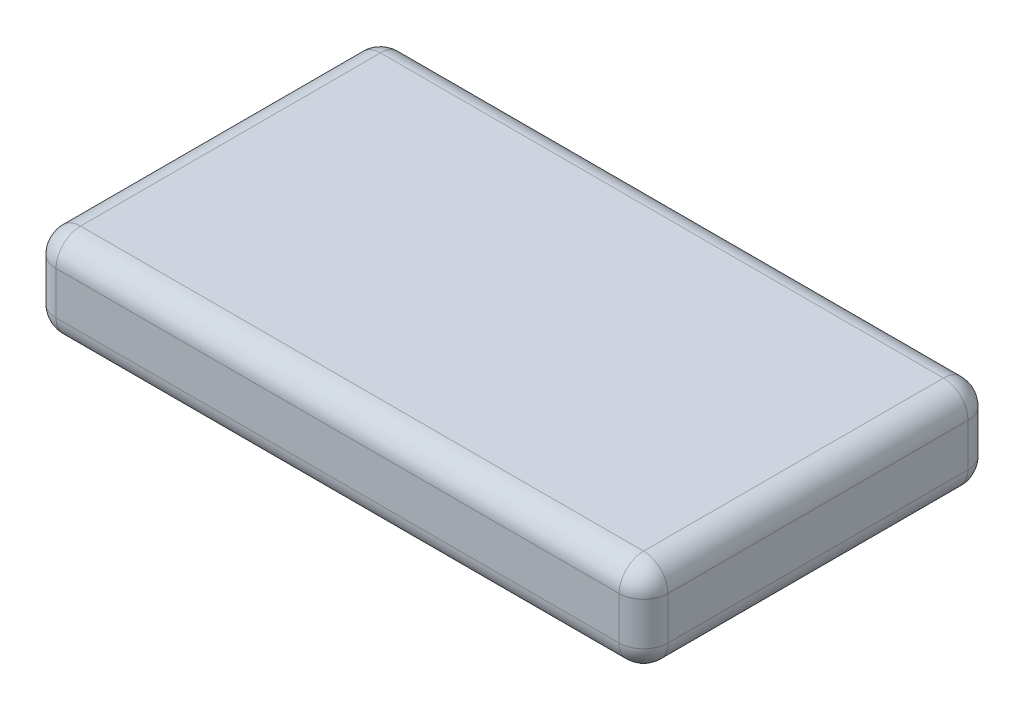
ISO-10303-21;
HEADER;
FILE_DESCRIPTION(('STEP AP214'),'2;1');
FILE_NAME('part.step','',(''),(''),'','','');
FILE_SCHEMA(('AUTOMOTIVE_DESIGN { 1 0 10303 214 1 1 1 1 }'));
ENDSEC;
DATA;
#1=APPLICATION_CONTEXT('core data for automotive mechanical design processes');
#2=APPLICATION_PROTOCOL_DEFINITION('international standard','automotive_design',2000,#1);
#3=PRODUCT_CONTEXT('',#1,'mechanical');
#4=PRODUCT('Part','Part','',(#3));
#5=PRODUCT_RELATED_PRODUCT_CATEGORY('part','',(#4));
#6=PRODUCT_DEFINITION_FORMATION('','',#4);
#7=PRODUCT_DEFINITION_CONTEXT('part definition',#1,'design');
#8=PRODUCT_DEFINITION('design','',#6,#7);
#9=PRODUCT_DEFINITION_SHAPE('','',#8);
#10=(LENGTH_UNIT() NAMED_UNIT(*) SI_UNIT(.MILLI.,.METRE.));
#11=(NAMED_UNIT(*) PLANE_ANGLE_UNIT() SI_UNIT($,.RADIAN.));
#12=(NAMED_UNIT(*) SI_UNIT($,.STERADIAN.) SOLID_ANGLE_UNIT());
#13=UNCERTAINTY_MEASURE_WITH_UNIT(LENGTH_MEASURE(1.E-05),#10,'distance_accuracy_value','');
#14=(GEOMETRIC_REPRESENTATION_CONTEXT(3) GLOBAL_UNCERTAINTY_ASSIGNED_CONTEXT((#13)) GLOBAL_UNIT_ASSIGNED_CONTEXT((#10,
#11,#12)) REPRESENTATION_CONTEXT('',''));
#15=CARTESIAN_POINT('',(0.,0.,0.));
#16=DIRECTION('',(0.,0.,1.));
#17=DIRECTION('',(1.,0.,0.));
#18=AXIS2_PLACEMENT_3D('',#15,#16,#17);
#19=CARTESIAN_POINT('',(-23.,2.,12.25));
#20=DIRECTION('',(1.,0.,0.));
#21=DIRECTION('',(0.,0.,-1.));
#22=AXIS2_PLACEMENT_3D('',#19,#20,#21);
#23=SPHERICAL_SURFACE('',#22,2.);
#24=CARTESIAN_POINT('',(-23.,2.,12.25));
#25=DIRECTION('',(0.,-1.,0.));
#26=DIRECTION('',(0.,0.,-1.));
#27=AXIS2_PLACEMENT_3D('',#24,#25,#26);
#28=CIRCLE('',#27,2.);
#29=CARTESIAN_POINT('',(-25.,2.,12.25));
#30=VERTEX_POINT('',#29);
#31=CARTESIAN_POINT('',(-23.,2.,14.25));
#32=VERTEX_POINT('',#31);
#33=EDGE_CURVE('E114',#30,#32,#28,.F.);
#34=ORIENTED_EDGE('',*,*,#33,.F.);
#35=CARTESIAN_POINT('',(-23.,2.,12.25));
#36=DIRECTION('',(0.,0.,1.));
#37=DIRECTION('',(1.,0.,0.));
#38=AXIS2_PLACEMENT_3D('',#35,#36,#37);
#39=CIRCLE('',#38,2.);
#40=CARTESIAN_POINT('',(-23.,0.,12.2499999999877));
#41=VERTEX_POINT('',#40);
#42=EDGE_CURVE('E109',#41,#30,#39,.F.);
#43=ORIENTED_EDGE('',*,*,#42,.F.);
#44=CARTESIAN_POINT('',(-23.,2.,12.25));
#45=DIRECTION('',(1.,0.,0.));
#46=DIRECTION('',(0.,0.,-1.));
#47=AXIS2_PLACEMENT_3D('',#44,#45,#46);
#48=CIRCLE('',#47,2.);
#49=EDGE_CURVE('E111',#32,#41,#48,.T.);
#50=ORIENTED_EDGE('',*,*,#49,.F.);
#51=EDGE_LOOP('',(#34,#43,#50));
#52=FACE_BOUND('',#51,.T.);
#53=ADVANCED_FACE('F16',(#52),#23,.T.);
#54=CARTESIAN_POINT('',(23.,2.,12.25));
#55=DIRECTION('',(1.,0.,0.));
#56=DIRECTION('',(0.,0.,-1.));
#57=AXIS2_PLACEMENT_3D('',#54,#55,#56);
#58=SPHERICAL_SURFACE('',#57,2.);
#59=CARTESIAN_POINT('',(23.,2.,12.25));
#60=DIRECTION('',(1.,0.,0.));
#61=DIRECTION('',(0.,0.,-1.));
#62=AXIS2_PLACEMENT_3D('',#59,#60,#61);
#63=CIRCLE('',#62,2.);
#64=CARTESIAN_POINT('',(23.,0.,12.25));
#65=VERTEX_POINT('',#64);
#66=CARTESIAN_POINT('',(23.,2.,14.25));
#67=VERTEX_POINT('',#66);
#68=EDGE_CURVE('E133',#65,#67,#63,.F.);
#69=ORIENTED_EDGE('',*,*,#68,.F.);
#70=CARTESIAN_POINT('',(23.,2.,12.25));
#71=DIRECTION('',(0.,0.,-1.));
#72=DIRECTION('',(-1.,0.,0.));
#73=AXIS2_PLACEMENT_3D('',#70,#71,#72);
#74=CIRCLE('',#73,2.);
#75=CARTESIAN_POINT('',(25.,2.,12.25));
#76=VERTEX_POINT('',#75);
#77=EDGE_CURVE('E270',#76,#65,#74,.T.);
#78=ORIENTED_EDGE('',*,*,#77,.F.);
#79=CARTESIAN_POINT('',(23.,2.,12.25));
#80=DIRECTION('',(0.,-1.,0.));
#81=DIRECTION('',(0.,0.,-1.));
#82=AXIS2_PLACEMENT_3D('',#79,#80,#81);
#83=CIRCLE('',#82,2.);
#84=EDGE_CURVE('E273',#67,#76,#83,.F.);
#85=ORIENTED_EDGE('',*,*,#84,.F.);
#86=EDGE_LOOP('',(#69,#78,#85));
#87=FACE_BOUND('',#86,.T.);
#88=ADVANCED_FACE('F154',(#87),#58,.T.);
#89=CARTESIAN_POINT('',(-23.,2.,-12.25));
#90=DIRECTION('',(1.,0.,0.));
#91=DIRECTION('',(0.,0.,-1.));
#92=AXIS2_PLACEMENT_3D('',#89,#90,#91);
#93=SPHERICAL_SURFACE('',#92,2.);
#94=CARTESIAN_POINT('',(-23.,2.,-12.25));
#95=DIRECTION('',(0.,-1.,0.));
#96=DIRECTION('',(0.,0.,-1.));
#97=AXIS2_PLACEMENT_3D('',#94,#95,#96);
#98=CIRCLE('',#97,2.);
#99=CARTESIAN_POINT('',(-23.,2.,-14.25));
#100=VERTEX_POINT('',#99);
#101=CARTESIAN_POINT('',(-25.,2.,-12.25));
#102=VERTEX_POINT('',#101);
#103=EDGE_CURVE('E263',#100,#102,#98,.F.);
#104=ORIENTED_EDGE('',*,*,#103,.F.);
#105=CARTESIAN_POINT('',(-23.,2.,-12.25));
#106=DIRECTION('',(-1.,0.,0.));
#107=DIRECTION('',(0.,0.,1.));
#108=AXIS2_PLACEMENT_3D('',#105,#106,#107);
#109=CIRCLE('',#108,2.);
#110=CARTESIAN_POINT('',(-23.,0.,-12.25));
#111=VERTEX_POINT('',#110);
#112=EDGE_CURVE('E260',#111,#100,#109,.F.);
#113=ORIENTED_EDGE('',*,*,#112,.F.);
#114=CARTESIAN_POINT('',(-23.,2.,-12.25));
#115=DIRECTION('',(0.,0.,1.));
#116=DIRECTION('',(1.,0.,0.));
#117=AXIS2_PLACEMENT_3D('',#114,#115,#116);
#118=CIRCLE('',#117,2.);
#119=EDGE_CURVE('E119',#102,#111,#118,.T.);
#120=ORIENTED_EDGE('',*,*,#119,.F.);
#121=EDGE_LOOP('',(#104,#113,#120));
#122=FACE_BOUND('',#121,.T.);
#123=ADVANCED_FACE('F152',(#122),#93,.T.);
#124=CARTESIAN_POINT('',(0.,0.,0.));
#125=DIRECTION('',(0.,1.,0.));
#126=DIRECTION('',(0.,0.,1.));
#127=AXIS2_PLACEMENT_3D('',#124,#125,#126);
#128=PLANE('',#127);
#129=DIRECTION('',(-1.,0.,0.));
#130=VECTOR('',#129,1.);
#131=CARTESIAN_POINT('',(-25.,0.,-12.25));
#132=LINE('',#131,#130);
#133=CARTESIAN_POINT('',(23.,0.,-12.2499999999877));
#134=VERTEX_POINT('',#133);
#135=EDGE_CURVE('E255',#134,#111,#132,.T.);
#136=ORIENTED_EDGE('',*,*,#135,.F.);
#137=DIRECTION('',(0.,0.,-1.));
#138=VECTOR('',#137,1.);
#139=CARTESIAN_POINT('',(23.,0.,-14.25));
#140=LINE('',#139,#138);
#141=EDGE_CURVE('E132',#65,#134,#140,.T.);
#142=ORIENTED_EDGE('',*,*,#141,.F.);
#143=DIRECTION('',(1.,0.,0.));
#144=VECTOR('',#143,1.);
#145=CARTESIAN_POINT('',(-25.,0.,12.25));
#146=LINE('',#145,#144);
#147=EDGE_CURVE('E125',#41,#65,#146,.T.);
#148=ORIENTED_EDGE('',*,*,#147,.F.);
#149=DIRECTION('',(0.,0.,1.));
#150=VECTOR('',#149,1.);
#151=CARTESIAN_POINT('',(-23.,0.,-14.25));
#152=LINE('',#151,#150);
#153=EDGE_CURVE('E104',#111,#41,#152,.T.);
#154=ORIENTED_EDGE('',*,*,#153,.F.);
#155=EDGE_LOOP('',(#136,#142,#148,#154));
#156=FACE_BOUND('',#155,.T.);
#157=ADVANCED_FACE('F130',(#156),#128,.F.);
#158=CARTESIAN_POINT('',(23.,2.,-12.25));
#159=DIRECTION('',(1.,0.,0.));
#160=DIRECTION('',(0.,0.,-1.));
#161=AXIS2_PLACEMENT_3D('',#158,#159,#160);
#162=SPHERICAL_SURFACE('',#161,2.);
#163=CARTESIAN_POINT('',(23.,2.,-12.25));
#164=DIRECTION('',(-1.,0.,0.));
#165=DIRECTION('',(0.,0.,1.));
#166=AXIS2_PLACEMENT_3D('',#163,#164,#165);
#167=CIRCLE('',#166,2.);
#168=CARTESIAN_POINT('',(23.,2.,-14.25));
#169=VERTEX_POINT('',#168);
#170=EDGE_CURVE('E257',#169,#134,#167,.T.);
#171=ORIENTED_EDGE('',*,*,#170,.F.);
#172=CARTESIAN_POINT('',(23.,2.,-12.25));
#173=DIRECTION('',(0.,-1.,0.));
#174=DIRECTION('',(0.,0.,-1.));
#175=AXIS2_PLACEMENT_3D('',#172,#173,#174);
#176=CIRCLE('',#175,2.);
#177=CARTESIAN_POINT('',(25.,2.,-12.25));
#178=VERTEX_POINT('',#177);
#179=EDGE_CURVE('E252',#178,#169,#176,.F.);
#180=ORIENTED_EDGE('',*,*,#179,.F.);
#181=CARTESIAN_POINT('',(23.,2.,-12.25));
#182=DIRECTION('',(0.,0.,-1.));
#183=DIRECTION('',(-1.,0.,0.));
#184=AXIS2_PLACEMENT_3D('',#181,#182,#183);
#185=CIRCLE('',#184,2.);
#186=EDGE_CURVE('E266',#134,#178,#185,.F.);
#187=ORIENTED_EDGE('',*,*,#186,.F.);
#188=EDGE_LOOP('',(#171,#180,#187));
#189=FACE_BOUND('',#188,.T.);
#190=ADVANCED_FACE('F144',(#189),#162,.T.);
#191=CARTESIAN_POINT('',(-23.,2.,-14.25));
#192=DIRECTION('',(0.,0.,1.));
#193=DIRECTION('',(1.,0.,0.));
#194=AXIS2_PLACEMENT_3D('',#191,#192,#193);
#195=CYLINDRICAL_SURFACE('',#194,2.);
#196=ORIENTED_EDGE('',*,*,#119,.T.);
#197=ORIENTED_EDGE('',*,*,#153,.T.);
#198=ORIENTED_EDGE('',*,*,#42,.T.);
#199=DIRECTION('',(0.,0.,-1.));
#200=VECTOR('',#199,1.);
#201=CARTESIAN_POINT('',(-25.,2.,-14.25));
#202=LINE('',#201,#200);
#203=EDGE_CURVE('E248',#30,#102,#202,.T.);
#204=ORIENTED_EDGE('',*,*,#203,.T.);
#205=EDGE_LOOP('',(#196,#197,#198,#204));
#206=FACE_BOUND('',#205,.T.);
#207=ADVANCED_FACE('F136',(#206),#195,.T.);
#208=CARTESIAN_POINT('',(-25.,2.,12.25));
#209=DIRECTION('',(1.,0.,0.));
#210=DIRECTION('',(0.,0.,-1.));
#211=AXIS2_PLACEMENT_3D('',#208,#209,#210);
#212=CYLINDRICAL_SURFACE('',#211,2.);
#213=ORIENTED_EDGE('',*,*,#68,.T.);
#214=DIRECTION('',(-1.,0.,0.));
#215=VECTOR('',#214,1.);
#216=CARTESIAN_POINT('',(-25.,2.,14.25));
#217=LINE('',#216,#215);
#218=EDGE_CURVE('E127',#67,#32,#217,.T.);
#219=ORIENTED_EDGE('',*,*,#218,.T.);
#220=ORIENTED_EDGE('',*,*,#49,.T.);
#221=ORIENTED_EDGE('',*,*,#147,.T.);
#222=EDGE_LOOP('',(#213,#219,#220,#221));
#223=FACE_BOUND('',#222,.T.);
#224=ADVANCED_FACE('F124',(#223),#212,.T.);
#225=CARTESIAN_POINT('',(-23.,7.5,12.25));
#226=DIRECTION('',(0.,-1.,0.));
#227=DIRECTION('',(0.,0.,-1.));
#228=AXIS2_PLACEMENT_3D('',#225,#226,#227);
#229=CYLINDRICAL_SURFACE('',#228,2.);
#230=ORIENTED_EDGE('',*,*,#33,.T.);
#231=DIRECTION('',(0.,1.,0.));
#232=VECTOR('',#231,1.);
#233=CARTESIAN_POINT('',(-23.,7.5,14.25));
#234=LINE('',#233,#232);
#235=CARTESIAN_POINT('',(-23.,5.5,14.25));
#236=VERTEX_POINT('',#235);
#237=EDGE_CURVE('E282',#32,#236,#234,.T.);
#238=ORIENTED_EDGE('',*,*,#237,.T.);
#239=CARTESIAN_POINT('',(-23.,5.5,12.25));
#240=DIRECTION('',(0.,-1.,0.));
#241=DIRECTION('',(1.,0.,0.));
#242=AXIS2_PLACEMENT_3D('',#239,#240,#241);
#243=CIRCLE('',#242,2.);
#244=CARTESIAN_POINT('',(-25.,5.5,12.25));
#245=VERTEX_POINT('',#244);
#246=EDGE_CURVE('E243',#245,#236,#243,.F.);
#247=ORIENTED_EDGE('',*,*,#246,.F.);
#248=DIRECTION('',(0.,1.,0.));
#249=VECTOR('',#248,1.);
#250=CARTESIAN_POINT('',(-25.,7.5,12.25));
#251=LINE('',#250,#249);
#252=EDGE_CURVE('E250',#245,#30,#251,.F.);
#253=ORIENTED_EDGE('',*,*,#252,.T.);
#254=EDGE_LOOP('',(#230,#238,#247,#253));
#255=FACE_BOUND('',#254,.T.);
#256=ADVANCED_FACE('F358',(#255),#229,.T.);
#257=CARTESIAN_POINT('',(23.,7.5,12.25));
#258=DIRECTION('',(0.,-1.,0.));
#259=DIRECTION('',(0.,0.,-1.));
#260=AXIS2_PLACEMENT_3D('',#257,#258,#259);
#261=CYLINDRICAL_SURFACE('',#260,2.);
#262=ORIENTED_EDGE('',*,*,#84,.T.);
#263=DIRECTION('',(0.,1.,0.));
#264=VECTOR('',#263,1.);
#265=CARTESIAN_POINT('',(25.,7.5,12.25));
#266=LINE('',#265,#264);
#267=CARTESIAN_POINT('',(25.,5.5,12.25));
#268=VERTEX_POINT('',#267);
#269=EDGE_CURVE('E215',#76,#268,#266,.T.);
#270=ORIENTED_EDGE('',*,*,#269,.T.);
#271=CARTESIAN_POINT('',(23.,5.5,12.25));
#272=DIRECTION('',(0.,-1.,0.));
#273=DIRECTION('',(1.,0.,0.));
#274=AXIS2_PLACEMENT_3D('',#271,#272,#273);
#275=CIRCLE('',#274,2.);
#276=CARTESIAN_POINT('',(23.,5.5,14.25));
#277=VERTEX_POINT('',#276);
#278=EDGE_CURVE('E217',#277,#268,#275,.F.);
#279=ORIENTED_EDGE('',*,*,#278,.F.);
#280=DIRECTION('',(0.,1.,0.));
#281=VECTOR('',#280,1.);
#282=CARTESIAN_POINT('',(23.,7.5,14.25));
#283=LINE('',#282,#281);
#284=EDGE_CURVE('E241',#277,#67,#283,.F.);
#285=ORIENTED_EDGE('',*,*,#284,.T.);
#286=EDGE_LOOP('',(#262,#270,#279,#285));
#287=FACE_BOUND('',#286,.T.);
#288=ADVANCED_FACE('F284',(#287),#261,.T.);
#289=CARTESIAN_POINT('',(23.,2.,-14.25));
#290=DIRECTION('',(0.,0.,-1.));
#291=DIRECTION('',(-1.,0.,0.));
#292=AXIS2_PLACEMENT_3D('',#289,#290,#291);
#293=CYLINDRICAL_SURFACE('',#292,2.);
#294=ORIENTED_EDGE('',*,*,#186,.T.);
#295=DIRECTION('',(0.,0.,1.));
#296=VECTOR('',#295,1.);
#297=CARTESIAN_POINT('',(25.,2.,-14.25));
#298=LINE('',#297,#296);
#299=EDGE_CURVE('E209',#178,#76,#298,.T.);
#300=ORIENTED_EDGE('',*,*,#299,.T.);
#301=ORIENTED_EDGE('',*,*,#77,.T.);
#302=ORIENTED_EDGE('',*,*,#141,.T.);
#303=EDGE_LOOP('',(#294,#300,#301,#302));
#304=FACE_BOUND('',#303,.T.);
#305=ADVANCED_FACE('F365',(#304),#293,.T.);
#306=CARTESIAN_POINT('',(-23.,7.5,-12.25));
#307=DIRECTION('',(0.,-1.,0.));
#308=DIRECTION('',(0.,0.,-1.));
#309=AXIS2_PLACEMENT_3D('',#306,#307,#308);
#310=CYLINDRICAL_SURFACE('',#309,2.);
#311=CARTESIAN_POINT('',(-23.,5.5,-12.25));
#312=DIRECTION('',(0.,1.,0.));
#313=DIRECTION('',(1.,0.,0.));
#314=AXIS2_PLACEMENT_3D('',#311,#312,#313);
#315=CIRCLE('',#314,2.);
#316=CARTESIAN_POINT('',(-23.,5.5,-14.25));
#317=VERTEX_POINT('',#316);
#318=CARTESIAN_POINT('',(-25.,5.5,-12.25));
#319=VERTEX_POINT('',#318);
#320=EDGE_CURVE('E204',#317,#319,#315,.T.);
#321=ORIENTED_EDGE('',*,*,#320,.F.);
#322=DIRECTION('',(0.,1.,0.));
#323=VECTOR('',#322,1.);
#324=CARTESIAN_POINT('',(-23.,7.5,-14.25));
#325=LINE('',#324,#323);
#326=EDGE_CURVE('E201',#317,#100,#325,.F.);
#327=ORIENTED_EDGE('',*,*,#326,.T.);
#328=ORIENTED_EDGE('',*,*,#103,.T.);
#329=DIRECTION('',(0.,1.,0.));
#330=VECTOR('',#329,1.);
#331=CARTESIAN_POINT('',(-25.,7.5,-12.25));
#332=LINE('',#331,#330);
#333=EDGE_CURVE('E246',#102,#319,#332,.T.);
#334=ORIENTED_EDGE('',*,*,#333,.T.);
#335=EDGE_LOOP('',(#321,#327,#328,#334));
#336=FACE_BOUND('',#335,.T.);
#337=ADVANCED_FACE('F328',(#336),#310,.T.);
#338=CARTESIAN_POINT('',(-25.,2.,-12.25));
#339=DIRECTION('',(-1.,0.,0.));
#340=DIRECTION('',(0.,0.,1.));
#341=AXIS2_PLACEMENT_3D('',#338,#339,#340);
#342=CYLINDRICAL_SURFACE('',#341,2.);
#343=ORIENTED_EDGE('',*,*,#170,.T.);
#344=ORIENTED_EDGE('',*,*,#135,.T.);
#345=ORIENTED_EDGE('',*,*,#112,.T.);
#346=DIRECTION('',(1.,0.,0.));
#347=VECTOR('',#346,1.);
#348=CARTESIAN_POINT('',(-25.,2.,-14.25));
#349=LINE('',#348,#347);
#350=EDGE_CURVE('E321',#100,#169,#349,.T.);
#351=ORIENTED_EDGE('',*,*,#350,.T.);
#352=EDGE_LOOP('',(#343,#344,#345,#351));
#353=FACE_BOUND('',#352,.T.);
#354=ADVANCED_FACE('F334',(#353),#342,.T.);
#355=CARTESIAN_POINT('',(23.,7.5,-12.25));
#356=DIRECTION('',(0.,-1.,0.));
#357=DIRECTION('',(0.,0.,-1.));
#358=AXIS2_PLACEMENT_3D('',#355,#356,#357);
#359=CYLINDRICAL_SURFACE('',#358,2.);
#360=ORIENTED_EDGE('',*,*,#179,.T.);
#361=DIRECTION('',(0.,1.,0.));
#362=VECTOR('',#361,1.);
#363=CARTESIAN_POINT('',(23.,7.5,-14.25));
#364=LINE('',#363,#362);
#365=CARTESIAN_POINT('',(23.,5.5,-14.25));
#366=VERTEX_POINT('',#365);
#367=EDGE_CURVE('E320',#169,#366,#364,.T.);
#368=ORIENTED_EDGE('',*,*,#367,.T.);
#369=CARTESIAN_POINT('',(23.,5.5,-12.25));
#370=DIRECTION('',(0.,1.,0.));
#371=DIRECTION('',(1.,0.,0.));
#372=AXIS2_PLACEMENT_3D('',#369,#370,#371);
#373=CIRCLE('',#372,2.);
#374=CARTESIAN_POINT('',(25.,5.5,-12.25));
#375=VERTEX_POINT('',#374);
#376=EDGE_CURVE('E203',#375,#366,#373,.T.);
#377=ORIENTED_EDGE('',*,*,#376,.F.);
#378=DIRECTION('',(0.,1.,0.));
#379=VECTOR('',#378,1.);
#380=CARTESIAN_POINT('',(25.,7.5,-12.25));
#381=LINE('',#380,#379);
#382=EDGE_CURVE('E212',#375,#178,#381,.F.);
#383=ORIENTED_EDGE('',*,*,#382,.T.);
#384=EDGE_LOOP('',(#360,#368,#377,#383));
#385=FACE_BOUND('',#384,.T.);
#386=ADVANCED_FACE('F338',(#385),#359,.T.);
#387=CARTESIAN_POINT('',(-25.,7.5,-14.25));
#388=DIRECTION('',(1.,0.,0.));
#389=DIRECTION('',(0.,0.,-1.));
#390=AXIS2_PLACEMENT_3D('',#387,#388,#389);
#391=PLANE('',#390);
#392=ORIENTED_EDGE('',*,*,#333,.F.);
#393=ORIENTED_EDGE('',*,*,#203,.F.);
#394=ORIENTED_EDGE('',*,*,#252,.F.);
#395=DIRECTION('',(0.,0.,-1.));
#396=VECTOR('',#395,1.);
#397=CARTESIAN_POINT('',(-25.,5.5,0.));
#398=LINE('',#397,#396);
#399=EDGE_CURVE('E311',#319,#245,#398,.F.);
#400=ORIENTED_EDGE('',*,*,#399,.F.);
#401=EDGE_LOOP('',(#392,#393,#394,#400));
#402=FACE_BOUND('',#401,.T.);
#403=ADVANCED_FACE('F235',(#402),#391,.F.);
#404=CARTESIAN_POINT('',(-23.,5.5,12.25));
#405=DIRECTION('',(1.,0.,0.));
#406=DIRECTION('',(0.,0.,-1.));
#407=AXIS2_PLACEMENT_3D('',#404,#405,#406);
#408=SPHERICAL_SURFACE('',#407,2.);
#409=ORIENTED_EDGE('',*,*,#246,.T.);
#410=CARTESIAN_POINT('',(-23.,5.5,12.25));
#411=DIRECTION('',(-1.,0.,0.));
#412=DIRECTION('',(0.,0.,1.));
#413=AXIS2_PLACEMENT_3D('',#410,#411,#412);
#414=CIRCLE('',#413,2.);
#415=CARTESIAN_POINT('',(-23.,7.5,12.25));
#416=VERTEX_POINT('',#415);
#417=EDGE_CURVE('E308',#416,#236,#414,.F.);
#418=ORIENTED_EDGE('',*,*,#417,.F.);
#419=CARTESIAN_POINT('',(-23.,5.5,12.25));
#420=DIRECTION('',(0.,0.,-1.));
#421=DIRECTION('',(-1.,0.,0.));
#422=AXIS2_PLACEMENT_3D('',#419,#420,#421);
#423=CIRCLE('',#422,2.);
#424=EDGE_CURVE('E317',#245,#416,#423,.T.);
#425=ORIENTED_EDGE('',*,*,#424,.F.);
#426=EDGE_LOOP('',(#409,#418,#425));
#427=FACE_BOUND('',#426,.T.);
#428=ADVANCED_FACE('F230',(#427),#408,.T.);
#429=CARTESIAN_POINT('',(-25.,7.5,14.25));
#430=DIRECTION('',(0.,0.,-1.));
#431=DIRECTION('',(-1.,0.,0.));
#432=AXIS2_PLACEMENT_3D('',#429,#430,#431);
#433=PLANE('',#432);
#434=ORIENTED_EDGE('',*,*,#218,.F.);
#435=ORIENTED_EDGE('',*,*,#284,.F.);
#436=DIRECTION('',(-1.,0.,0.));
#437=VECTOR('',#436,1.);
#438=CARTESIAN_POINT('',(0.,5.5,14.25));
#439=LINE('',#438,#437);
#440=EDGE_CURVE('E303',#236,#277,#439,.F.);
#441=ORIENTED_EDGE('',*,*,#440,.F.);
#442=ORIENTED_EDGE('',*,*,#237,.F.);
#443=EDGE_LOOP('',(#434,#435,#441,#442));
#444=FACE_BOUND('',#443,.T.);
#445=ADVANCED_FACE('F226',(#444),#433,.F.);
#446=CARTESIAN_POINT('',(23.,5.5,12.25));
#447=DIRECTION('',(1.,0.,0.));
#448=DIRECTION('',(0.,0.,-1.));
#449=AXIS2_PLACEMENT_3D('',#446,#447,#448);
#450=SPHERICAL_SURFACE('',#449,2.);
#451=ORIENTED_EDGE('',*,*,#278,.T.);
#452=CARTESIAN_POINT('',(23.,5.5,12.25));
#453=DIRECTION('',(0.,0.,1.));
#454=DIRECTION('',(1.,0.,0.));
#455=AXIS2_PLACEMENT_3D('',#452,#453,#454);
#456=CIRCLE('',#455,2.);
#457=CARTESIAN_POINT('',(23.,7.5,12.2499999999755));
#458=VERTEX_POINT('',#457);
#459=EDGE_CURVE('E289',#458,#268,#456,.F.);
#460=ORIENTED_EDGE('',*,*,#459,.F.);
#461=CARTESIAN_POINT('',(23.,5.5,12.25));
#462=DIRECTION('',(-1.,0.,0.));
#463=DIRECTION('',(0.,0.,1.));
#464=AXIS2_PLACEMENT_3D('',#461,#462,#463);
#465=CIRCLE('',#464,2.);
#466=EDGE_CURVE('E291',#277,#458,#465,.T.);
#467=ORIENTED_EDGE('',*,*,#466,.F.);
#468=EDGE_LOOP('',(#451,#460,#467));
#469=FACE_BOUND('',#468,.T.);
#470=ADVANCED_FACE('F222',(#469),#450,.T.);
#471=CARTESIAN_POINT('',(25.,7.5,-14.25));
#472=DIRECTION('',(-1.,0.,0.));
#473=DIRECTION('',(0.,0.,1.));
#474=AXIS2_PLACEMENT_3D('',#471,#472,#473);
#475=PLANE('',#474);
#476=ORIENTED_EDGE('',*,*,#382,.F.);
#477=DIRECTION('',(0.,0.,1.));
#478=VECTOR('',#477,1.);
#479=CARTESIAN_POINT('',(25.,5.5,0.));
#480=LINE('',#479,#478);
#481=EDGE_CURVE('E296',#268,#375,#480,.F.);
#482=ORIENTED_EDGE('',*,*,#481,.F.);
#483=ORIENTED_EDGE('',*,*,#269,.F.);
#484=ORIENTED_EDGE('',*,*,#299,.F.);
#485=EDGE_LOOP('',(#476,#482,#483,#484));
#486=FACE_BOUND('',#485,.T.);
#487=ADVANCED_FACE('F225',(#486),#475,.F.);
#488=CARTESIAN_POINT('',(-23.,5.5,-12.25));
#489=DIRECTION('',(1.,0.,0.));
#490=DIRECTION('',(0.,0.,-1.));
#491=AXIS2_PLACEMENT_3D('',#488,#489,#490);
#492=SPHERICAL_SURFACE('',#491,2.);
#493=CARTESIAN_POINT('',(-23.,5.5,-12.25));
#494=DIRECTION('',(0.,0.,-1.));
#495=DIRECTION('',(-1.,0.,0.));
#496=AXIS2_PLACEMENT_3D('',#493,#494,#495);
#497=CIRCLE('',#496,2.);
#498=CARTESIAN_POINT('',(-23.,7.5,-12.2500000000491));
#499=VERTEX_POINT('',#498);
#500=EDGE_CURVE('E314',#499,#319,#497,.F.);
#501=ORIENTED_EDGE('',*,*,#500,.F.);
#502=CARTESIAN_POINT('',(-23.,5.5,-12.25));
#503=DIRECTION('',(1.,0.,0.));
#504=DIRECTION('',(0.,0.,-1.));
#505=AXIS2_PLACEMENT_3D('',#502,#503,#504);
#506=CIRCLE('',#505,2.);
#507=EDGE_CURVE('E340',#317,#499,#506,.T.);
#508=ORIENTED_EDGE('',*,*,#507,.F.);
#509=ORIENTED_EDGE('',*,*,#320,.T.);
#510=EDGE_LOOP('',(#501,#508,#509));
#511=FACE_BOUND('',#510,.T.);
#512=ADVANCED_FACE('F195',(#511),#492,.T.);
#513=CARTESIAN_POINT('',(23.,5.5,-12.25));
#514=DIRECTION('',(1.,0.,0.));
#515=DIRECTION('',(0.,0.,-1.));
#516=AXIS2_PLACEMENT_3D('',#513,#514,#515);
#517=SPHERICAL_SURFACE('',#516,2.);
#518=CARTESIAN_POINT('',(23.,5.5,-12.25));
#519=DIRECTION('',(0.,0.,1.));
#520=DIRECTION('',(1.,0.,0.));
#521=AXIS2_PLACEMENT_3D('',#518,#519,#520);
#522=CIRCLE('',#521,2.);
#523=CARTESIAN_POINT('',(23.,7.5,-12.25));
#524=VERTEX_POINT('',#523);
#525=EDGE_CURVE('E298',#375,#524,#522,.T.);
#526=ORIENTED_EDGE('',*,*,#525,.F.);
#527=ORIENTED_EDGE('',*,*,#376,.T.);
#528=CARTESIAN_POINT('',(23.,5.5,-12.25));
#529=DIRECTION('',(1.,0.,0.));
#530=DIRECTION('',(0.,0.,-1.));
#531=AXIS2_PLACEMENT_3D('',#528,#529,#530);
#532=CIRCLE('',#531,2.);
#533=EDGE_CURVE('E34',#524,#366,#532,.F.);
#534=ORIENTED_EDGE('',*,*,#533,.F.);
#535=EDGE_LOOP('',(#526,#527,#534));
#536=FACE_BOUND('',#535,.T.);
#537=ADVANCED_FACE('F190',(#536),#517,.T.);
#538=CARTESIAN_POINT('',(-25.,7.5,-14.25));
#539=DIRECTION('',(0.,0.,1.));
#540=DIRECTION('',(1.,0.,0.));
#541=AXIS2_PLACEMENT_3D('',#538,#539,#540);
#542=PLANE('',#541);
#543=ORIENTED_EDGE('',*,*,#350,.F.);
#544=ORIENTED_EDGE('',*,*,#326,.F.);
#545=DIRECTION('',(1.,0.,0.));
#546=VECTOR('',#545,1.);
#547=CARTESIAN_POINT('',(0.,5.5,-14.25));
#548=LINE('',#547,#546);
#549=EDGE_CURVE('E336',#366,#317,#548,.F.);
#550=ORIENTED_EDGE('',*,*,#549,.F.);
#551=ORIENTED_EDGE('',*,*,#367,.F.);
#552=EDGE_LOOP('',(#543,#544,#550,#551));
#553=FACE_BOUND('',#552,.T.);
#554=ADVANCED_FACE('F186',(#553),#542,.F.);
#555=CARTESIAN_POINT('',(-23.,5.5,0.));
#556=DIRECTION('',(0.,0.,-1.));
#557=DIRECTION('',(-1.,0.,0.));
#558=AXIS2_PLACEMENT_3D('',#555,#556,#557);
#559=CYLINDRICAL_SURFACE('',#558,2.);
#560=ORIENTED_EDGE('',*,*,#500,.T.);
#561=ORIENTED_EDGE('',*,*,#399,.T.);
#562=ORIENTED_EDGE('',*,*,#424,.T.);
#563=DIRECTION('',(0.,0.,1.));
#564=VECTOR('',#563,1.);
#565=CARTESIAN_POINT('',(-23.,7.5,0.));
#566=LINE('',#565,#564);
#567=EDGE_CURVE('E346',#499,#416,#566,.T.);
#568=ORIENTED_EDGE('',*,*,#567,.F.);
#569=EDGE_LOOP('',(#560,#561,#562,#568));
#570=FACE_BOUND('',#569,.T.);
#571=ADVANCED_FACE('F182',(#570),#559,.T.);
#572=CARTESIAN_POINT('',(0.,5.5,12.25));
#573=DIRECTION('',(-1.,0.,0.));
#574=DIRECTION('',(0.,0.,1.));
#575=AXIS2_PLACEMENT_3D('',#572,#573,#574);
#576=CYLINDRICAL_SURFACE('',#575,2.);
#577=ORIENTED_EDGE('',*,*,#466,.T.);
#578=DIRECTION('',(1.,0.,0.));
#579=VECTOR('',#578,1.);
#580=CARTESIAN_POINT('',(0.,7.5,12.25));
#581=LINE('',#580,#579);
#582=EDGE_CURVE('E349',#416,#458,#581,.T.);
#583=ORIENTED_EDGE('',*,*,#582,.F.);
#584=ORIENTED_EDGE('',*,*,#417,.T.);
#585=ORIENTED_EDGE('',*,*,#440,.T.);
#586=EDGE_LOOP('',(#577,#583,#584,#585));
#587=FACE_BOUND('',#586,.T.);
#588=ADVANCED_FACE('F178',(#587),#576,.T.);
#589=CARTESIAN_POINT('',(23.,5.5,0.));
#590=DIRECTION('',(0.,0.,1.));
#591=DIRECTION('',(1.,0.,0.));
#592=AXIS2_PLACEMENT_3D('',#589,#590,#591);
#593=CYLINDRICAL_SURFACE('',#592,2.);
#594=ORIENTED_EDGE('',*,*,#525,.T.);
#595=DIRECTION('',(0.,0.,1.));
#596=VECTOR('',#595,1.);
#597=CARTESIAN_POINT('',(23.,7.5,0.));
#598=LINE('',#597,#596);
#599=EDGE_CURVE('E25',#458,#524,#598,.F.);
#600=ORIENTED_EDGE('',*,*,#599,.F.);
#601=ORIENTED_EDGE('',*,*,#459,.T.);
#602=ORIENTED_EDGE('',*,*,#481,.T.);
#603=EDGE_LOOP('',(#594,#600,#601,#602));
#604=FACE_BOUND('',#603,.T.);
#605=ADVANCED_FACE('F171',(#604),#593,.T.);
#606=CARTESIAN_POINT('',(0.,5.5,-12.25));
#607=DIRECTION('',(1.,0.,0.));
#608=DIRECTION('',(0.,0.,-1.));
#609=AXIS2_PLACEMENT_3D('',#606,#607,#608);
#610=CYLINDRICAL_SURFACE('',#609,2.);
#611=ORIENTED_EDGE('',*,*,#533,.T.);
#612=ORIENTED_EDGE('',*,*,#549,.T.);
#613=ORIENTED_EDGE('',*,*,#507,.T.);
#614=DIRECTION('',(1.,0.,0.));
#615=VECTOR('',#614,1.);
#616=CARTESIAN_POINT('',(0.,7.5,-12.25));
#617=LINE('',#616,#615);
#618=EDGE_CURVE('E10',#524,#499,#617,.F.);
#619=ORIENTED_EDGE('',*,*,#618,.F.);
#620=EDGE_LOOP('',(#611,#612,#613,#619));
#621=FACE_BOUND('',#620,.T.);
#622=ADVANCED_FACE('F165',(#621),#610,.T.);
#623=CARTESIAN_POINT('',(0.,7.5,0.));
#624=DIRECTION('',(0.,1.,0.));
#625=DIRECTION('',(0.,0.,1.));
#626=AXIS2_PLACEMENT_3D('',#623,#624,#625);
#627=PLANE('',#626);
#628=ORIENTED_EDGE('',*,*,#599,.T.);
#629=ORIENTED_EDGE('',*,*,#618,.T.);
#630=ORIENTED_EDGE('',*,*,#567,.T.);
#631=ORIENTED_EDGE('',*,*,#582,.T.);
#632=EDGE_LOOP('',(#628,#629,#630,#631));
#633=FACE_BOUND('',#632,.T.);
#634=ADVANCED_FACE('F163',(#633),#627,.T.);
#635=CLOSED_SHELL('',(#53,#88,#123,#157,#190,#207,#224,#256,#288,#305,#337,#354,#386,#403,#428,
#445,#470,#487,#512,#537,#554,#571,#588,#605,#622,#634));
#636=MANIFOLD_SOLID_BREP('B1',#635);
#637=ADVANCED_BREP_SHAPE_REPRESENTATION('',(#18,#636),#14);
#638=SHAPE_DEFINITION_REPRESENTATION(#9,#637);
ENDSEC;
END-ISO-10303-21;
